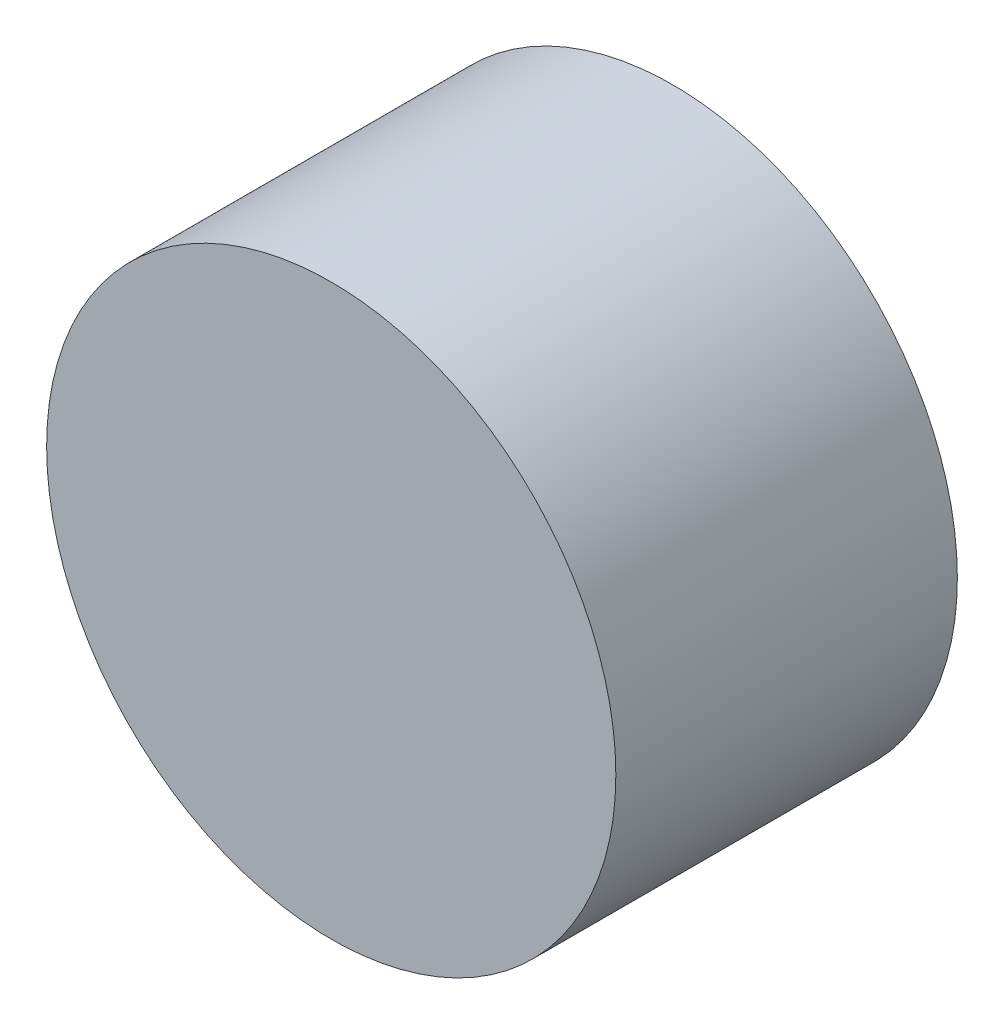
ISO-10303-21;
HEADER;
FILE_DESCRIPTION(('STEP AP214'),'2;1');
FILE_NAME('part.step','',(''),(''),'','','');
FILE_SCHEMA(('AUTOMOTIVE_DESIGN { 1 0 10303 214 1 1 1 1 }'));
ENDSEC;
DATA;
#1=APPLICATION_CONTEXT('core data for automotive mechanical design processes');
#2=APPLICATION_PROTOCOL_DEFINITION('international standard','automotive_design',2000,#1);
#3=PRODUCT_CONTEXT('',#1,'mechanical');
#4=PRODUCT('Part','Part','',(#3));
#5=PRODUCT_RELATED_PRODUCT_CATEGORY('part','',(#4));
#6=PRODUCT_DEFINITION_FORMATION('','',#4);
#7=PRODUCT_DEFINITION_CONTEXT('part definition',#1,'design');
#8=PRODUCT_DEFINITION('design','',#6,#7);
#9=PRODUCT_DEFINITION_SHAPE('','',#8);
#10=(LENGTH_UNIT() NAMED_UNIT(*) SI_UNIT(.MILLI.,.METRE.));
#11=(NAMED_UNIT(*) PLANE_ANGLE_UNIT() SI_UNIT($,.RADIAN.));
#12=(NAMED_UNIT(*) SI_UNIT($,.STERADIAN.) SOLID_ANGLE_UNIT());
#13=UNCERTAINTY_MEASURE_WITH_UNIT(LENGTH_MEASURE(1.E-05),#10,'distance_accuracy_value','');
#14=(GEOMETRIC_REPRESENTATION_CONTEXT(3) GLOBAL_UNCERTAINTY_ASSIGNED_CONTEXT((#13)) GLOBAL_UNIT_ASSIGNED_CONTEXT((#10,
#11,#12)) REPRESENTATION_CONTEXT('',''));
#15=CARTESIAN_POINT('',(0.,0.,0.));
#16=DIRECTION('',(0.,0.,1.));
#17=DIRECTION('',(1.,0.,0.));
#18=AXIS2_PLACEMENT_3D('',#15,#16,#17);
#19=CARTESIAN_POINT('',(0.,0.,6.));
#20=DIRECTION('',(0.,0.,-1.));
#21=DIRECTION('',(-1.,0.,0.));
#22=AXIS2_PLACEMENT_3D('',#19,#20,#21);
#23=CYLINDRICAL_SURFACE('',#22,5.);
#24=CARTESIAN_POINT('',(0.,0.,6.));
#25=DIRECTION('',(0.,0.,1.));
#26=DIRECTION('',(1.,0.,0.));
#27=AXIS2_PLACEMENT_3D('',#24,#25,#26);
#28=CIRCLE('',#27,5.);
#29=CARTESIAN_POINT('',(5.,0.,6.));
#30=VERTEX_POINT('',#29);
#31=EDGE_CURVE('E10',#30,#30,#28,.T.);
#32=ORIENTED_EDGE('',*,*,#31,.F.);
#33=EDGE_LOOP('',(#32));
#34=FACE_BOUND('',#33,.T.);
#35=CARTESIAN_POINT('',(0.,0.,0.));
#36=DIRECTION('',(0.,0.,1.));
#37=DIRECTION('',(1.,0.,0.));
#38=AXIS2_PLACEMENT_3D('',#35,#36,#37);
#39=CIRCLE('',#38,5.);
#40=CARTESIAN_POINT('',(5.,0.,0.));
#41=VERTEX_POINT('',#40);
#42=EDGE_CURVE('E44',#41,#41,#39,.T.);
#43=ORIENTED_EDGE('',*,*,#42,.T.);
#44=EDGE_LOOP('',(#43));
#45=FACE_BOUND('',#44,.T.);
#46=ADVANCED_FACE('F41',(#34,#45),#23,.T.);
#47=CARTESIAN_POINT('',(0.,0.,6.));
#48=DIRECTION('',(0.,0.,1.));
#49=DIRECTION('',(1.,0.,0.));
#50=AXIS2_PLACEMENT_3D('',#47,#48,#49);
#51=PLANE('',#50);
#52=ORIENTED_EDGE('',*,*,#31,.T.);
#53=EDGE_LOOP('',(#52));
#54=FACE_BOUND('',#53,.T.);
#55=ADVANCED_FACE('F58',(#54),#51,.T.);
#56=CARTESIAN_POINT('',(0.,0.,0.));
#57=DIRECTION('',(0.,0.,1.));
#58=DIRECTION('',(1.,0.,0.));
#59=AXIS2_PLACEMENT_3D('',#56,#57,#58);
#60=PLANE('',#59);
#61=ORIENTED_EDGE('',*,*,#42,.F.);
#62=EDGE_LOOP('',(#61));
#63=FACE_BOUND('',#62,.T.);
#64=ADVANCED_FACE('F56',(#63),#60,.F.);
#65=CLOSED_SHELL('',(#46,#55,#64));
#66=MANIFOLD_SOLID_BREP('B2',#65);
#67=ADVANCED_BREP_SHAPE_REPRESENTATION('',(#18,#66),#14);
#68=SHAPE_DEFINITION_REPRESENTATION(#9,#67);
ENDSEC;
END-ISO-10303-21;
